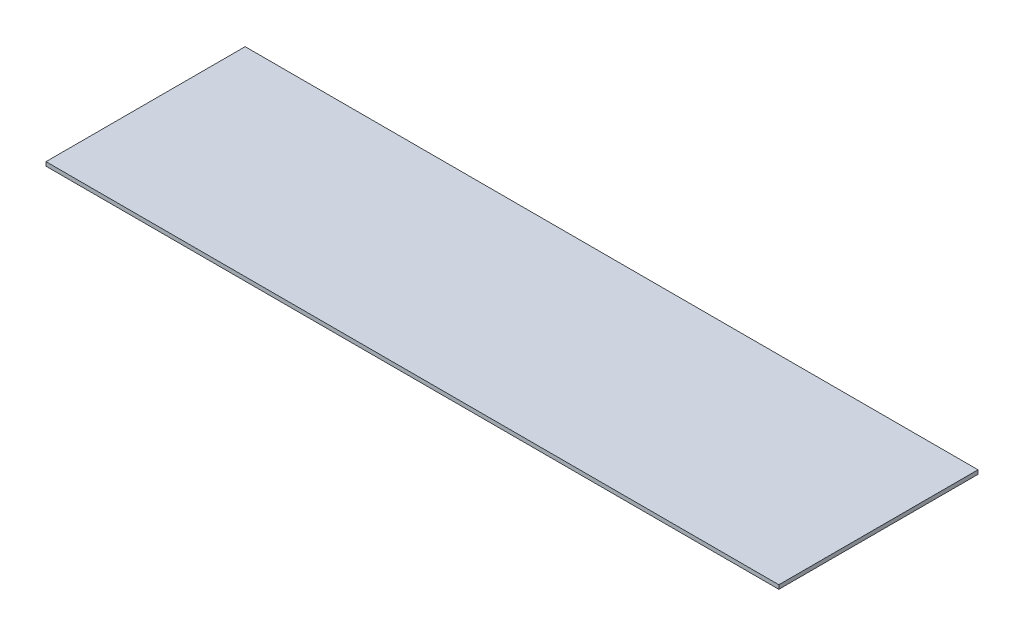
ISO-10303-21;
HEADER;
FILE_DESCRIPTION(('STEP AP214'),'2;1');
FILE_NAME('part.step','',(''),(''),'','','');
FILE_SCHEMA(('AUTOMOTIVE_DESIGN { 1 0 10303 214 1 1 1 1 }'));
ENDSEC;
DATA;
#1=APPLICATION_CONTEXT('core data for automotive mechanical design processes');
#2=APPLICATION_PROTOCOL_DEFINITION('international standard','automotive_design',2000,#1);
#3=PRODUCT_CONTEXT('',#1,'mechanical');
#4=PRODUCT('Part','Part','',(#3));
#5=PRODUCT_RELATED_PRODUCT_CATEGORY('part','',(#4));
#6=PRODUCT_DEFINITION_FORMATION('','',#4);
#7=PRODUCT_DEFINITION_CONTEXT('part definition',#1,'design');
#8=PRODUCT_DEFINITION('design','',#6,#7);
#9=PRODUCT_DEFINITION_SHAPE('','',#8);
#10=(LENGTH_UNIT() NAMED_UNIT(*) SI_UNIT(.MILLI.,.METRE.));
#11=(NAMED_UNIT(*) PLANE_ANGLE_UNIT() SI_UNIT($,.RADIAN.));
#12=(NAMED_UNIT(*) SI_UNIT($,.STERADIAN.) SOLID_ANGLE_UNIT());
#13=UNCERTAINTY_MEASURE_WITH_UNIT(LENGTH_MEASURE(1.E-05),#10,'distance_accuracy_value','');
#14=(GEOMETRIC_REPRESENTATION_CONTEXT(3) GLOBAL_UNCERTAINTY_ASSIGNED_CONTEXT((#13)) GLOBAL_UNIT_ASSIGNED_CONTEXT((#10,
#11,#12)) REPRESENTATION_CONTEXT('',''));
#15=CARTESIAN_POINT('',(0.,0.,0.));
#16=DIRECTION('',(0.,0.,1.));
#17=DIRECTION('',(1.,0.,0.));
#18=AXIS2_PLACEMENT_3D('',#15,#16,#17);
#19=CARTESIAN_POINT('',(460.,5.,125.));
#20=DIRECTION('',(-1.,0.,0.));
#21=DIRECTION('',(0.,0.,1.));
#22=AXIS2_PLACEMENT_3D('',#19,#20,#21);
#23=PLANE('',#22);
#24=DIRECTION('',(0.,0.,-1.));
#25=VECTOR('',#24,1.);
#26=CARTESIAN_POINT('',(460.,0.,125.));
#27=LINE('',#26,#25);
#28=CARTESIAN_POINT('',(460.,0.,125.));
#29=VERTEX_POINT('',#28);
#30=CARTESIAN_POINT('',(460.,0.,-125.));
#31=VERTEX_POINT('',#30);
#32=EDGE_CURVE('E96',#29,#31,#27,.T.);
#33=ORIENTED_EDGE('',*,*,#32,.T.);
#34=DIRECTION('',(0.,-1.,0.));
#35=VECTOR('',#34,1.);
#36=CARTESIAN_POINT('',(460.,5.,-125.));
#37=LINE('',#36,#35);
#38=CARTESIAN_POINT('',(460.,5.,-125.));
#39=VERTEX_POINT('',#38);
#40=EDGE_CURVE('E11',#39,#31,#37,.T.);
#41=ORIENTED_EDGE('',*,*,#40,.F.);
#42=DIRECTION('',(0.,0.,-1.));
#43=VECTOR('',#42,1.);
#44=CARTESIAN_POINT('',(460.,5.,125.));
#45=LINE('',#44,#43);
#46=CARTESIAN_POINT('',(460.,5.,125.));
#47=VERTEX_POINT('',#46);
#48=EDGE_CURVE('E84',#47,#39,#45,.T.);
#49=ORIENTED_EDGE('',*,*,#48,.F.);
#50=DIRECTION('',(0.,-1.,0.));
#51=VECTOR('',#50,1.);
#52=CARTESIAN_POINT('',(460.,5.,125.));
#53=LINE('',#52,#51);
#54=EDGE_CURVE('E92',#47,#29,#53,.T.);
#55=ORIENTED_EDGE('',*,*,#54,.T.);
#56=EDGE_LOOP('',(#33,#41,#49,#55));
#57=FACE_BOUND('',#56,.T.);
#58=ADVANCED_FACE('F33',(#57),#23,.F.);
#59=CARTESIAN_POINT('',(-460.,5.,-125.));
#60=DIRECTION('',(0.,0.,1.));
#61=DIRECTION('',(1.,0.,0.));
#62=AXIS2_PLACEMENT_3D('',#59,#60,#61);
#63=PLANE('',#62);
#64=DIRECTION('',(-1.,0.,0.));
#65=VECTOR('',#64,1.);
#66=CARTESIAN_POINT('',(-460.,0.,-125.));
#67=LINE('',#66,#65);
#68=CARTESIAN_POINT('',(-460.,0.,-125.));
#69=VERTEX_POINT('',#68);
#70=EDGE_CURVE('E88',#31,#69,#67,.T.);
#71=ORIENTED_EDGE('',*,*,#70,.T.);
#72=DIRECTION('',(0.,-1.,0.));
#73=VECTOR('',#72,1.);
#74=CARTESIAN_POINT('',(-460.,5.,-125.));
#75=LINE('',#74,#73);
#76=CARTESIAN_POINT('',(-460.,5.,-125.));
#77=VERTEX_POINT('',#76);
#78=EDGE_CURVE('E41',#77,#69,#75,.T.);
#79=ORIENTED_EDGE('',*,*,#78,.F.);
#80=DIRECTION('',(-1.,0.,0.));
#81=VECTOR('',#80,1.);
#82=CARTESIAN_POINT('',(-460.,5.,-125.));
#83=LINE('',#82,#81);
#84=EDGE_CURVE('E79',#39,#77,#83,.T.);
#85=ORIENTED_EDGE('',*,*,#84,.F.);
#86=ORIENTED_EDGE('',*,*,#40,.T.);
#87=EDGE_LOOP('',(#71,#79,#85,#86));
#88=FACE_BOUND('',#87,.T.);
#89=ADVANCED_FACE('F87',(#88),#63,.F.);
#90=CARTESIAN_POINT('',(-460.,5.,125.));
#91=DIRECTION('',(1.,0.,0.));
#92=DIRECTION('',(0.,0.,-1.));
#93=AXIS2_PLACEMENT_3D('',#90,#91,#92);
#94=PLANE('',#93);
#95=DIRECTION('',(0.,0.,1.));
#96=VECTOR('',#95,1.);
#97=CARTESIAN_POINT('',(-460.,0.,125.));
#98=LINE('',#97,#96);
#99=CARTESIAN_POINT('',(-460.,0.,125.));
#100=VERTEX_POINT('',#99);
#101=EDGE_CURVE('E66',#69,#100,#98,.T.);
#102=ORIENTED_EDGE('',*,*,#101,.T.);
#103=DIRECTION('',(0.,-1.,0.));
#104=VECTOR('',#103,1.);
#105=CARTESIAN_POINT('',(-460.,5.,125.));
#106=LINE('',#105,#104);
#107=CARTESIAN_POINT('',(-460.,5.,125.));
#108=VERTEX_POINT('',#107);
#109=EDGE_CURVE('E89',#108,#100,#106,.T.);
#110=ORIENTED_EDGE('',*,*,#109,.F.);
#111=DIRECTION('',(0.,0.,1.));
#112=VECTOR('',#111,1.);
#113=CARTESIAN_POINT('',(-460.,5.,125.));
#114=LINE('',#113,#112);
#115=EDGE_CURVE('E82',#77,#108,#114,.T.);
#116=ORIENTED_EDGE('',*,*,#115,.F.);
#117=ORIENTED_EDGE('',*,*,#78,.T.);
#118=EDGE_LOOP('',(#102,#110,#116,#117));
#119=FACE_BOUND('',#118,.T.);
#120=ADVANCED_FACE('F90',(#119),#94,.F.);
#121=CARTESIAN_POINT('',(-460.,5.,125.));
#122=DIRECTION('',(0.,0.,-1.));
#123=DIRECTION('',(-1.,0.,0.));
#124=AXIS2_PLACEMENT_3D('',#121,#122,#123);
#125=PLANE('',#124);
#126=DIRECTION('',(1.,0.,0.));
#127=VECTOR('',#126,1.);
#128=CARTESIAN_POINT('',(-460.,0.,125.));
#129=LINE('',#128,#127);
#130=EDGE_CURVE('E72',#100,#29,#129,.T.);
#131=ORIENTED_EDGE('',*,*,#130,.T.);
#132=ORIENTED_EDGE('',*,*,#54,.F.);
#133=DIRECTION('',(1.,0.,0.));
#134=VECTOR('',#133,1.);
#135=CARTESIAN_POINT('',(-460.,5.,125.));
#136=LINE('',#135,#134);
#137=EDGE_CURVE('E49',#108,#47,#136,.T.);
#138=ORIENTED_EDGE('',*,*,#137,.F.);
#139=ORIENTED_EDGE('',*,*,#109,.T.);
#140=EDGE_LOOP('',(#131,#132,#138,#139));
#141=FACE_BOUND('',#140,.T.);
#142=ADVANCED_FACE('F103',(#141),#125,.F.);
#143=CARTESIAN_POINT('',(0.,5.,0.));
#144=DIRECTION('',(0.,-1.,0.));
#145=DIRECTION('',(0.,0.,-1.));
#146=AXIS2_PLACEMENT_3D('',#143,#144,#145);
#147=PLANE('',#146);
#148=ORIENTED_EDGE('',*,*,#48,.T.);
#149=ORIENTED_EDGE('',*,*,#84,.T.);
#150=ORIENTED_EDGE('',*,*,#115,.T.);
#151=ORIENTED_EDGE('',*,*,#137,.T.);
#152=EDGE_LOOP('',(#148,#149,#150,#151));
#153=FACE_BOUND('',#152,.T.);
#154=ADVANCED_FACE('F80',(#153),#147,.F.);
#155=CARTESIAN_POINT('',(0.,0.,0.));
#156=DIRECTION('',(0.,-1.,0.));
#157=DIRECTION('',(0.,0.,-1.));
#158=AXIS2_PLACEMENT_3D('',#155,#156,#157);
#159=PLANE('',#158);
#160=ORIENTED_EDGE('',*,*,#32,.F.);
#161=ORIENTED_EDGE('',*,*,#130,.F.);
#162=ORIENTED_EDGE('',*,*,#101,.F.);
#163=ORIENTED_EDGE('',*,*,#70,.F.);
#164=EDGE_LOOP('',(#160,#161,#162,#163));
#165=FACE_BOUND('',#164,.T.);
#166=ADVANCED_FACE('F106',(#165),#159,.T.);
#167=CLOSED_SHELL('',(#58,#89,#120,#142,#154,#166));
#168=MANIFOLD_SOLID_BREP('B2',#167);
#169=ADVANCED_BREP_SHAPE_REPRESENTATION('',(#18,#168),#14);
#170=SHAPE_DEFINITION_REPRESENTATION(#9,#169);
ENDSEC;
END-ISO-10303-21;
